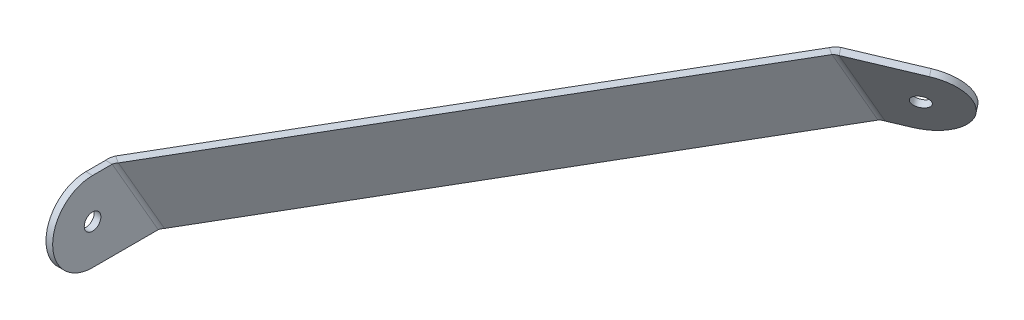
ISO-10303-21;
HEADER;
FILE_DESCRIPTION(('STEP AP214'),'2;1');
FILE_NAME('part.step','',(''),(''),'','','');
FILE_SCHEMA(('AUTOMOTIVE_DESIGN { 1 0 10303 214 1 1 1 1 }'));
ENDSEC;
DATA;
#1=APPLICATION_CONTEXT('core data for automotive mechanical design processes');
#2=APPLICATION_PROTOCOL_DEFINITION('international standard','automotive_design',2000,#1);
#3=PRODUCT_CONTEXT('',#1,'mechanical');
#4=PRODUCT('Part','Part','',(#3));
#5=PRODUCT_RELATED_PRODUCT_CATEGORY('part','',(#4));
#6=PRODUCT_DEFINITION_FORMATION('','',#4);
#7=PRODUCT_DEFINITION_CONTEXT('part definition',#1,'design');
#8=PRODUCT_DEFINITION('design','',#6,#7);
#9=PRODUCT_DEFINITION_SHAPE('','',#8);
#10=(LENGTH_UNIT() NAMED_UNIT(*) SI_UNIT(.MILLI.,.METRE.));
#11=(NAMED_UNIT(*) PLANE_ANGLE_UNIT() SI_UNIT($,.RADIAN.));
#12=(NAMED_UNIT(*) SI_UNIT($,.STERADIAN.) SOLID_ANGLE_UNIT());
#13=UNCERTAINTY_MEASURE_WITH_UNIT(LENGTH_MEASURE(1.E-05),#10,'distance_accuracy_value','');
#14=(GEOMETRIC_REPRESENTATION_CONTEXT(3) GLOBAL_UNCERTAINTY_ASSIGNED_CONTEXT((#13)) GLOBAL_UNIT_ASSIGNED_CONTEXT((#10,
#11,#12)) REPRESENTATION_CONTEXT('',''));
#15=CARTESIAN_POINT('',(0.,0.,0.));
#16=DIRECTION('',(0.,0.,1.));
#17=DIRECTION('',(1.,0.,0.));
#18=AXIS2_PLACEMENT_3D('',#15,#16,#17);
#19=CARTESIAN_POINT('',(-12.4707185432573,1.7039530518519,-2.95133325951953));
#20=DIRECTION('',(0.866025403784438,-0.250000000000003,0.433012701892219));
#21=DIRECTION('',(0.433012701892219,-0.0580127018922199,-0.899519052838329));
#22=AXIS2_PLACEMENT_3D('',#19,#20,#21);
#23=PLANE('',#22);
#24=DIRECTION('',(0.433012701892219,-0.0580127018922199,-0.899519052838329));
#25=VECTOR('',#24,1.);
#26=CARTESIAN_POINT('',(-7.70821854325723,20.1158990373753,-1.84619128847272));
#27=LINE('',#26,#25);
#28=CARTESIAN_POINT('',(-2.2391874454343,19.3831878043541,-13.2072845117416));
#29=VERTEX_POINT('',#28);
#30=CARTESIAN_POINT('',(108.455132698563,4.55296095970573,-243.158160260638));
#31=VERTEX_POINT('',#30);
#32=EDGE_CURVE('E525',#29,#31,#27,.T.);
#33=ORIENTED_EDGE('',*,*,#32,.T.);
#34=DIRECTION('',(0.,-0.866025403784437,-0.500000000000003));
#35=VECTOR('',#34,1.);
#36=CARTESIAN_POINT('',(108.455132698564,106.428812201527,-184.34011012225));
#37=LINE('',#36,#35);
#38=CARTESIAN_POINT('',(108.455132698563,-33.5470390402943,-265.155205516763));
#39=VERTEX_POINT('',#38);
#40=EDGE_CURVE('E548',#31,#39,#37,.T.);
#41=ORIENTED_EDGE('',*,*,#40,.T.);
#42=DIRECTION('',(0.433012701892219,-0.0580127018922199,-0.899519052838329));
#43=VECTOR('',#42,1.);
#44=CARTESIAN_POINT('',(-17.2332185432573,-16.7079929336715,-4.0564752305663));
#45=LINE('',#44,#43);
#46=CARTESIAN_POINT('',(-2.23918744543432,-18.7168121956459,-35.2043297678666));
#47=VERTEX_POINT('',#46);
#48=EDGE_CURVE('E521',#47,#39,#45,.T.);
#49=ORIENTED_EDGE('',*,*,#48,.F.);
#50=DIRECTION('',(0.,-0.866025403784436,-0.500000000000005));
#51=VECTOR('',#50,1.);
#52=CARTESIAN_POINT('',(-2.2391874454343,10.5647189021771,-18.2986299062539));
#53=LINE('',#52,#51);
#54=EDGE_CURVE('E524',#29,#47,#53,.T.);
#55=ORIENTED_EDGE('',*,*,#54,.F.);
#56=EDGE_LOOP('',(#33,#41,#49,#55));
#57=FACE_BOUND('',#56,.T.);
#58=ADVANCED_FACE('F70',(#57),#23,.F.);
#59=CARTESIAN_POINT('',(-17.2332185432573,-16.7079929336715,-4.0564752305663));
#60=DIRECTION('',(-0.250000000000003,-0.966506350946109,-0.0580127018922199));
#61=DIRECTION('',(0.433012701892219,-0.0580127018922199,-0.899519052838329));
#62=AXIS2_PLACEMENT_3D('',#59,#60,#61);
#63=PLANE('',#62);
#64=CARTESIAN_POINT('',(111.204763355579,-34.3407890402943,-263.780390188255));
#65=CARTESIAN_POINT('',(108.455132698563,-33.5470390402943,-265.155205516763));
#66=B_SPLINE_CURVE_WITH_KNOTS('',1,(#64,#65),.UNSPECIFIED.,.F.,.F.,(2,2),(0.,1.),.UNSPECIFIED.);
#67=CARTESIAN_POINT('',(111.204763355579,-34.3407890402943,-263.780390188255));
#68=VERTEX_POINT('',#67);
#69=EDGE_CURVE('E12',#68,#39,#66,.T.);
#70=ORIENTED_EDGE('',*,*,#69,.F.);
#71=DIRECTION('',(0.433012701892219,-0.0580127018922199,-0.899519052838329));
#72=VECTOR('',#71,1.);
#73=CARTESIAN_POINT('',(-14.4835878862417,-17.5017429336715,-2.68165990205852));
#74=LINE('',#73,#72);
#75=CARTESIAN_POINT('',(0.510443211581293,-19.5105621956459,-33.8295144393588));
#76=VERTEX_POINT('',#75);
#77=EDGE_CURVE('E89',#76,#68,#74,.T.);
#78=ORIENTED_EDGE('',*,*,#77,.F.);
#79=CARTESIAN_POINT('',(-2.23918744543431,-18.7168121956459,-35.2043297678666));
#80=CARTESIAN_POINT('',(0.510443211581283,-19.5105621956459,-33.8295144393589));
#81=B_SPLINE_CURVE_WITH_KNOTS('',1,(#79,#80),.UNSPECIFIED.,.F.,.F.,(2,2),(0.,1.),.UNSPECIFIED.);
#82=EDGE_CURVE('E542',#76,#47,#81,.F.);
#83=ORIENTED_EDGE('',*,*,#82,.T.);
#84=ORIENTED_EDGE('',*,*,#48,.T.);
#85=EDGE_LOOP('',(#70,#78,#83,#84));
#86=FACE_BOUND('',#85,.T.);
#87=ADVANCED_FACE('F72',(#86),#63,.T.);
#88=CARTESIAN_POINT('',(-7.70821854325723,20.1158990373753,-1.84619128847272));
#89=DIRECTION('',(-0.250000000000003,-0.966506350946109,-0.0580127018922199));
#90=DIRECTION('',(0.433012701892219,-0.0580127018922199,-0.899519052838329));
#91=AXIS2_PLACEMENT_3D('',#88,#89,#90);
#92=PLANE('',#91);
#93=CARTESIAN_POINT('',(108.455132698564,4.55296095970571,-243.158160260638));
#94=CARTESIAN_POINT('',(111.204763355579,3.7592109597057,-241.78334493213));
#95=B_SPLINE_CURVE_WITH_KNOTS('',1,(#93,#94),.UNSPECIFIED.,.F.,.F.,(2,2),(0.,1.),.UNSPECIFIED.);
#96=CARTESIAN_POINT('',(111.204763355579,3.75921095970574,-241.78334493213));
#97=VERTEX_POINT('',#96);
#98=EDGE_CURVE('E305',#31,#97,#95,.T.);
#99=ORIENTED_EDGE('',*,*,#98,.F.);
#100=ORIENTED_EDGE('',*,*,#32,.F.);
#101=CARTESIAN_POINT('',(0.510443211581287,18.5894378043541,-11.8324691832338));
#102=CARTESIAN_POINT('',(-2.23918744543431,19.3831878043541,-13.2072845117416));
#103=B_SPLINE_CURVE_WITH_KNOTS('',1,(#101,#102),.UNSPECIFIED.,.F.,.F.,(2,2),(0.,1.),.UNSPECIFIED.);
#104=CARTESIAN_POINT('',(0.510443211581295,18.5894378043541,-11.8324691832338));
#105=VERTEX_POINT('',#104);
#106=EDGE_CURVE('E669',#29,#105,#103,.F.);
#107=ORIENTED_EDGE('',*,*,#106,.T.);
#108=DIRECTION('',(0.433012701892219,-0.0580127018922199,-0.899519052838329));
#109=VECTOR('',#108,1.);
#110=CARTESIAN_POINT('',(-4.95858788624162,19.3221490373753,-0.471375959964944));
#111=LINE('',#110,#109);
#112=EDGE_CURVE('E97',#105,#97,#111,.T.);
#113=ORIENTED_EDGE('',*,*,#112,.T.);
#114=EDGE_LOOP('',(#99,#100,#107,#113));
#115=FACE_BOUND('',#114,.T.);
#116=ADVANCED_FACE('F607',(#115),#92,.F.);
#117=CARTESIAN_POINT('',(-9.72108788624168,0.910203051851891,-1.57651793101173));
#118=DIRECTION('',(0.866025403784438,-0.250000000000003,0.433012701892219));
#119=DIRECTION('',(0.433012701892219,-0.0580127018922199,-0.899519052838329));
#120=AXIS2_PLACEMENT_3D('',#117,#118,#119);
#121=PLANE('',#120);
#122=DIRECTION('',(0.,-0.866025403784437,-0.500000000000003));
#123=VECTOR('',#122,1.);
#124=CARTESIAN_POINT('',(111.204763355579,105.635062201527,-182.965294793742));
#125=LINE('',#124,#123);
#126=EDGE_CURVE('E82',#97,#68,#125,.T.);
#127=ORIENTED_EDGE('',*,*,#126,.F.);
#128=ORIENTED_EDGE('',*,*,#112,.F.);
#129=DIRECTION('',(0.,-0.866025403784436,-0.500000000000005));
#130=VECTOR('',#129,1.);
#131=CARTESIAN_POINT('',(0.510443211581293,9.77096890217713,-16.9238145777461));
#132=LINE('',#131,#130);
#133=EDGE_CURVE('E545',#105,#76,#132,.T.);
#134=ORIENTED_EDGE('',*,*,#133,.T.);
#135=ORIENTED_EDGE('',*,*,#77,.T.);
#136=EDGE_LOOP('',(#127,#128,#134,#135));
#137=FACE_BOUND('',#136,.T.);
#138=ADVANCED_FACE('F611',(#137),#121,.T.);
#139=CARTESIAN_POINT('',(-3.175,0.,0.));
#140=DIRECTION('',(1.,0.,0.));
#141=DIRECTION('',(0.,0.,-1.));
#142=AXIS2_PLACEMENT_3D('',#139,#140,#141);
#143=CYLINDRICAL_SURFACE('',#142,19.05);
#144=DIRECTION('',(-1.,0.,0.));
#145=VECTOR('',#144,1.);
#146=CARTESIAN_POINT('',(-3.175,-19.05,0.));
#147=LINE('',#146,#145);
#148=CARTESIAN_POINT('',(0.,-19.05,0.));
#149=VERTEX_POINT('',#148);
#150=CARTESIAN_POINT('',(-3.175,-19.05,0.));
#151=VERTEX_POINT('',#150);
#152=EDGE_CURVE('E459',#149,#151,#147,.T.);
#153=ORIENTED_EDGE('',*,*,#152,.F.);
#154=CARTESIAN_POINT('',(0.,0.,0.));
#155=DIRECTION('',(1.,0.,0.));
#156=DIRECTION('',(0.,0.,-1.));
#157=AXIS2_PLACEMENT_3D('',#154,#155,#156);
#158=CIRCLE('',#157,19.05);
#159=CARTESIAN_POINT('',(0.,19.05,0.));
#160=VERTEX_POINT('',#159);
#161=EDGE_CURVE('E455',#160,#149,#158,.T.);
#162=ORIENTED_EDGE('',*,*,#161,.F.);
#163=DIRECTION('',(-1.,0.,0.));
#164=VECTOR('',#163,1.);
#165=CARTESIAN_POINT('',(-3.175,19.05,0.));
#166=LINE('',#165,#164);
#167=CARTESIAN_POINT('',(-3.175,19.05,0.));
#168=VERTEX_POINT('',#167);
#169=EDGE_CURVE('E469',#160,#168,#166,.T.);
#170=ORIENTED_EDGE('',*,*,#169,.T.);
#171=CARTESIAN_POINT('',(-3.175,0.,0.));
#172=DIRECTION('',(1.,0.,0.));
#173=DIRECTION('',(0.,0.,-1.));
#174=AXIS2_PLACEMENT_3D('',#171,#172,#173);
#175=CIRCLE('',#174,19.05);
#176=EDGE_CURVE('E466',#168,#151,#175,.T.);
#177=ORIENTED_EDGE('',*,*,#176,.T.);
#178=EDGE_LOOP('',(#153,#162,#170,#177));
#179=FACE_BOUND('',#178,.T.);
#180=ADVANCED_FACE('F402',(#179),#143,.T.);
#181=CARTESIAN_POINT('',(-3.175,0.,0.));
#182=DIRECTION('',(1.,0.,0.));
#183=DIRECTION('',(0.,0.,-1.));
#184=AXIS2_PLACEMENT_3D('',#181,#182,#183);
#185=CYLINDRICAL_SURFACE('',#184,3.96874999999999);
#186=CARTESIAN_POINT('',(-3.175,0.,0.));
#187=DIRECTION('',(-1.,0.,0.));
#188=DIRECTION('',(0.,0.,1.));
#189=AXIS2_PLACEMENT_3D('',#186,#187,#188);
#190=CIRCLE('',#189,3.96874999999999);
#191=CARTESIAN_POINT('',(-3.175,0.,3.96874999999999));
#192=VERTEX_POINT('',#191);
#193=EDGE_CURVE('E462',#192,#192,#190,.T.);
#194=ORIENTED_EDGE('',*,*,#193,.T.);
#195=EDGE_LOOP('',(#194));
#196=FACE_BOUND('',#195,.T.);
#197=CARTESIAN_POINT('',(0.,0.,0.));
#198=DIRECTION('',(-1.,0.,0.));
#199=DIRECTION('',(0.,0.,1.));
#200=AXIS2_PLACEMENT_3D('',#197,#198,#199);
#201=CIRCLE('',#200,3.96874999999999);
#202=CARTESIAN_POINT('',(0.,0.,3.96874999999999));
#203=VERTEX_POINT('',#202);
#204=EDGE_CURVE('E445',#203,#203,#201,.T.);
#205=ORIENTED_EDGE('',*,*,#204,.F.);
#206=EDGE_LOOP('',(#205));
#207=FACE_BOUND('',#206,.T.);
#208=ADVANCED_FACE('F690',(#196,#207),#185,.F.);
#209=CARTESIAN_POINT('',(-3.175,0.,0.));
#210=DIRECTION('',(1.,0.,0.));
#211=DIRECTION('',(0.,0.,-1.));
#212=AXIS2_PLACEMENT_3D('',#209,#210,#211);
#213=PLANE('',#212);
#214=ORIENTED_EDGE('',*,*,#193,.F.);
#215=EDGE_LOOP('',(#214));
#216=FACE_BOUND('',#215,.T.);
#217=DIRECTION('',(0.,0.,-1.));
#218=VECTOR('',#217,1.);
#219=CARTESIAN_POINT('',(-3.175,19.05,0.));
#220=LINE('',#219,#218);
#221=CARTESIAN_POINT('',(-3.175,19.05,-9.36685894998663));
#222=VERTEX_POINT('',#221);
#223=EDGE_CURVE('E465',#168,#222,#220,.T.);
#224=ORIENTED_EDGE('',*,*,#223,.T.);
#225=DIRECTION('',(0.,-0.866025403784436,-0.500000000000005));
#226=VECTOR('',#225,1.);
#227=CARTESIAN_POINT('',(-3.175,8.81846890217713,-15.2740361835368));
#228=LINE('',#227,#226);
#229=CARTESIAN_POINT('',(-3.175,-19.05,-31.3639042061116));
#230=VERTEX_POINT('',#229);
#231=EDGE_CURVE('E461',#222,#230,#228,.T.);
#232=ORIENTED_EDGE('',*,*,#231,.T.);
#233=DIRECTION('',(0.,0.,-1.));
#234=VECTOR('',#233,1.);
#235=CARTESIAN_POINT('',(-3.175,-19.05,0.));
#236=LINE('',#235,#234);
#237=EDGE_CURVE('E458',#151,#230,#236,.T.);
#238=ORIENTED_EDGE('',*,*,#237,.F.);
#239=ORIENTED_EDGE('',*,*,#176,.F.);
#240=EDGE_LOOP('',(#224,#232,#238,#239));
#241=FACE_BOUND('',#240,.T.);
#242=ADVANCED_FACE('F498',(#216,#241),#213,.F.);
#243=CARTESIAN_POINT('',(-3.175,-19.05,0.));
#244=DIRECTION('',(0.,-1.,0.));
#245=DIRECTION('',(0.,0.,-1.));
#246=AXIS2_PLACEMENT_3D('',#243,#244,#245);
#247=PLANE('',#246);
#248=CARTESIAN_POINT('',(0.,-19.05,-31.3639042061116));
#249=CARTESIAN_POINT('',(-3.175,-19.05,-31.3639042061116));
#250=B_SPLINE_CURVE_WITH_KNOTS('',1,(#248,#249),.UNSPECIFIED.,.F.,.F.,(2,2),(0.,1.),.UNSPECIFIED.);
#251=CARTESIAN_POINT('',(0.,-19.05,-31.3639042061116));
#252=VERTEX_POINT('',#251);
#253=EDGE_CURVE('E441',#252,#230,#250,.T.);
#254=ORIENTED_EDGE('',*,*,#253,.F.);
#255=DIRECTION('',(0.,0.,-1.));
#256=VECTOR('',#255,1.);
#257=CARTESIAN_POINT('',(0.,-19.05,0.));
#258=LINE('',#257,#256);
#259=EDGE_CURVE('E454',#149,#252,#258,.T.);
#260=ORIENTED_EDGE('',*,*,#259,.F.);
#261=ORIENTED_EDGE('',*,*,#152,.T.);
#262=ORIENTED_EDGE('',*,*,#237,.T.);
#263=EDGE_LOOP('',(#254,#260,#261,#262));
#264=FACE_BOUND('',#263,.T.);
#265=ADVANCED_FACE('F487',(#264),#247,.T.);
#266=CARTESIAN_POINT('',(0.,0.,0.));
#267=DIRECTION('',(1.,0.,0.));
#268=DIRECTION('',(0.,0.,-1.));
#269=AXIS2_PLACEMENT_3D('',#266,#267,#268);
#270=PLANE('',#269);
#271=DIRECTION('',(0.,-0.866025403784436,-0.500000000000005));
#272=VECTOR('',#271,1.);
#273=CARTESIAN_POINT('',(0.,8.81846890217713,-15.2740361835368));
#274=LINE('',#273,#272);
#275=CARTESIAN_POINT('',(0.,19.05,-9.36685894998663));
#276=VERTEX_POINT('',#275);
#277=EDGE_CURVE('E485',#276,#252,#274,.T.);
#278=ORIENTED_EDGE('',*,*,#277,.F.);
#279=DIRECTION('',(0.,0.,-1.));
#280=VECTOR('',#279,1.);
#281=CARTESIAN_POINT('',(0.,19.05,0.));
#282=LINE('',#281,#280);
#283=EDGE_CURVE('E453',#160,#276,#282,.T.);
#284=ORIENTED_EDGE('',*,*,#283,.F.);
#285=ORIENTED_EDGE('',*,*,#161,.T.);
#286=ORIENTED_EDGE('',*,*,#259,.T.);
#287=EDGE_LOOP('',(#278,#284,#285,#286));
#288=FACE_BOUND('',#287,.T.);
#289=ORIENTED_EDGE('',*,*,#204,.T.);
#290=EDGE_LOOP('',(#289));
#291=FACE_BOUND('',#290,.T.);
#292=ADVANCED_FACE('F497',(#288,#291),#270,.T.);
#293=CARTESIAN_POINT('',(-3.175,19.05,0.));
#294=DIRECTION('',(0.,-1.,0.));
#295=DIRECTION('',(0.,0.,-1.));
#296=AXIS2_PLACEMENT_3D('',#293,#294,#295);
#297=PLANE('',#296);
#298=CARTESIAN_POINT('',(-3.175,19.05,-9.36685894998662));
#299=CARTESIAN_POINT('',(0.,19.05,-9.36685894998662));
#300=B_SPLINE_CURVE_WITH_KNOTS('',1,(#298,#299),.UNSPECIFIED.,.F.,.F.,(2,2),(0.,1.),.UNSPECIFIED.);
#301=EDGE_CURVE('E428',#222,#276,#300,.T.);
#302=ORIENTED_EDGE('',*,*,#301,.F.);
#303=ORIENTED_EDGE('',*,*,#223,.F.);
#304=ORIENTED_EDGE('',*,*,#169,.F.);
#305=ORIENTED_EDGE('',*,*,#283,.T.);
#306=EDGE_LOOP('',(#302,#303,#304,#305));
#307=FACE_BOUND('',#306,.T.);
#308=ADVANCED_FACE('F401',(#307),#297,.F.);
#309=CARTESIAN_POINT('',(-3.175,19.05,-9.36685894998662));
#310=CARTESIAN_POINT('',(-3.175,19.1887319368214,-10.6964678397321));
#311=CARTESIAN_POINT('',(-2.84960796744824,19.3262367104913,-12.0193241970861));
#312=CARTESIAN_POINT('',(-2.23918744543431,19.3831878043541,-13.2072845117416));
#313=CARTESIAN_POINT('',(0.,19.05,-9.36685894998662));
#314=CARTESIAN_POINT('',(0.,18.9113125892921,-10.2156138173841));
#315=CARTESIAN_POINT('',(0.177593425882297,18.7727186307015,-11.0609523774069));
#316=CARTESIAN_POINT('',(0.510443211581287,18.5894378043541,-11.8324691832338));
#317=B_SPLINE_SURFACE_WITH_KNOTS('',1,3,((#309,#310,#311,#312),(#313,#314,#315,#316)),
.UNSPECIFIED.,.F.,.F.,.F.,(2,2),(4,4),(0.,1.),(0.,1.),.UNSPECIFIED.);
#318=CARTESIAN_POINT('',(0.,19.05,-9.36685894998662));
#319=CARTESIAN_POINT('',(0.,18.9113125892921,-10.2156138173841));
#320=CARTESIAN_POINT('',(0.177593425882297,18.7727186307015,-11.0609523774069));
#321=CARTESIAN_POINT('',(0.510443211581287,18.5894378043541,-11.8324691832338));
#322=B_SPLINE_CURVE_WITH_KNOTS('',3,(#318,#319,#320,#321),.UNSPECIFIED.,.F.,.F.,(4,4),(0.,1.),.UNSPECIFIED.);
#323=EDGE_CURVE('E554',#276,#105,#322,.T.);
#324=CARTESIAN_POINT('',(-2.23918744543431,19.3831878043541,-13.2072845117416));
#325=CARTESIAN_POINT('',(-2.84960796744824,19.3262367104913,-12.0193241970861));
#326=CARTESIAN_POINT('',(-3.175,19.1887319368214,-10.6964678397321));
#327=CARTESIAN_POINT('',(-3.175,19.05,-9.36685894998662));
#328=B_SPLINE_CURVE_WITH_KNOTS('',3,(#324,#325,#326,#327),.UNSPECIFIED.,.F.,.F.,(4,4),(0.,1.),.UNSPECIFIED.);
#329=EDGE_CURVE('E384',#222,#29,#328,.F.);
#330=ORIENTED_EDGE('',*,*,#301,.T.);
#331=ORIENTED_EDGE('',*,*,#323,.T.);
#332=ORIENTED_EDGE('',*,*,#106,.F.);
#333=ORIENTED_EDGE('',*,*,#329,.F.);
#334=EDGE_LOOP('',(#330,#331,#332,#333));
#335=FACE_BOUND('',#334,.T.);
#336=ADVANCED_FACE('F390',(#335),#317,.T.);
#337=CARTESIAN_POINT('',(-2.23918744543431,-18.7168121956459,-35.2043297678666));
#338=CARTESIAN_POINT('',(-2.84960796744824,-18.7737632895088,-34.0163694532111));
#339=CARTESIAN_POINT('',(-3.175,-18.9112680631787,-32.6935130958571));
#340=CARTESIAN_POINT('',(-3.175,-19.05,-31.3639042061116));
#341=CARTESIAN_POINT('',(0.510443211581283,-19.5105621956459,-33.8295144393589));
#342=CARTESIAN_POINT('',(0.1775934258823,-19.3272813692986,-33.0579976335319));
#343=CARTESIAN_POINT('',(0.,-19.1886874107079,-32.2126590735092));
#344=CARTESIAN_POINT('',(0.,-19.05,-31.3639042061116));
#345=B_SPLINE_SURFACE_WITH_KNOTS('',1,3,((#337,#338,#339,#340),(#341,#342,#343,#344)),
.UNSPECIFIED.,.F.,.F.,.F.,(2,2),(4,4),(0.,1.),(0.,1.),.UNSPECIFIED.);
#346=CARTESIAN_POINT('',(0.510443211581283,-19.5105621956459,-33.8295144393589));
#347=CARTESIAN_POINT('',(0.1775934258823,-19.3272813692986,-33.0579976335319));
#348=CARTESIAN_POINT('',(0.,-19.1886874107079,-32.2126590735092));
#349=CARTESIAN_POINT('',(0.,-19.05,-31.3639042061116));
#350=B_SPLINE_CURVE_WITH_KNOTS('',3,(#346,#347,#348,#349),.UNSPECIFIED.,.F.,.F.,(4,4),(0.,1.),.UNSPECIFIED.);
#351=EDGE_CURVE('E347',#76,#252,#350,.T.);
#352=CARTESIAN_POINT('',(-3.175,-19.05,-31.3639042061116));
#353=CARTESIAN_POINT('',(-3.175,-18.9112680631787,-32.6935130958571));
#354=CARTESIAN_POINT('',(-2.84960796744824,-18.7737632895088,-34.0163694532111));
#355=CARTESIAN_POINT('',(-2.23918744543431,-18.7168121956459,-35.2043297678666));
#356=B_SPLINE_CURVE_WITH_KNOTS('',3,(#352,#353,#354,#355),.UNSPECIFIED.,.F.,.F.,(4,4),(0.,1.),.UNSPECIFIED.);
#357=EDGE_CURVE('E340',#47,#230,#356,.F.);
#358=ORIENTED_EDGE('',*,*,#82,.F.);
#359=ORIENTED_EDGE('',*,*,#351,.T.);
#360=ORIENTED_EDGE('',*,*,#253,.T.);
#361=ORIENTED_EDGE('',*,*,#357,.F.);
#362=EDGE_LOOP('',(#358,#359,#360,#361));
#363=FACE_BOUND('',#362,.T.);
#364=ADVANCED_FACE('F360',(#363),#345,.T.);
#365=CARTESIAN_POINT('',(3.81,39.6841629259491,2.54628056981283));
#366=DIRECTION('',(0.,-0.866025403784436,-0.500000000000005));
#367=DIRECTION('',(0.,0.500000000000005,-0.866025403784436));
#368=AXIS2_PLACEMENT_3D('',#365,#366,#367);
#369=CYLINDRICAL_SURFACE('',#368,6.985);
#370=ORIENTED_EDGE('',*,*,#357,.T.);
#371=ORIENTED_EDGE('',*,*,#231,.F.);
#372=ORIENTED_EDGE('',*,*,#329,.T.);
#373=ORIENTED_EDGE('',*,*,#54,.T.);
#374=EDGE_LOOP('',(#370,#371,#372,#373));
#375=FACE_BOUND('',#374,.T.);
#376=ADVANCED_FACE('F279',(#375),#369,.T.);
#377=CARTESIAN_POINT('',(3.81,39.6841629259491,2.54628056981283));
#378=DIRECTION('',(0.,-0.866025403784436,-0.500000000000005));
#379=DIRECTION('',(0.,0.500000000000005,-0.866025403784436));
#380=AXIS2_PLACEMENT_3D('',#377,#378,#379);
#381=CYLINDRICAL_SURFACE('',#380,3.81);
#382=ORIENTED_EDGE('',*,*,#351,.F.);
#383=ORIENTED_EDGE('',*,*,#133,.F.);
#384=ORIENTED_EDGE('',*,*,#323,.F.);
#385=ORIENTED_EDGE('',*,*,#277,.T.);
#386=EDGE_LOOP('',(#382,#383,#384,#385));
#387=FACE_BOUND('',#386,.T.);
#388=ADVANCED_FACE('F275',(#387),#381,.F.);
#389=CARTESIAN_POINT('',(108.455132698564,4.55296095970571,-243.158160260638));
#390=CARTESIAN_POINT('',(109.065553220577,4.60991205356854,-244.346120575294));
#391=CARTESIAN_POINT('',(109.954540785887,4.58472081096256,-245.387179166269));
#392=CARTESIAN_POINT('',(111.011820143998,4.41824248677693,-246.188148376959));
#393=CARTESIAN_POINT('',(111.204763355579,3.7592109597057,-241.78334493213));
#394=CARTESIAN_POINT('',(111.537613141278,3.57593013335837,-242.554861737957));
#395=CARTESIAN_POINT('',(112.022807403879,3.34853946182649,-243.246399879621));
#396=CARTESIAN_POINT('',(112.599320143998,3.04342715826912,-243.806898376959));
#397=B_SPLINE_SURFACE_WITH_KNOTS('',1,3,((#389,#390,#391,#392),(#393,#394,#395,#396)),
.UNSPECIFIED.,.F.,.F.,.F.,(2,2),(4,4),(0.,1.),(0.,1.),.UNSPECIFIED.);
#398=CARTESIAN_POINT('',(111.204763355579,3.7592109597057,-241.78334493213));
#399=CARTESIAN_POINT('',(111.537613141278,3.57593013335837,-242.554861737957));
#400=CARTESIAN_POINT('',(112.022807403879,3.34853946182649,-243.246399879621));
#401=CARTESIAN_POINT('',(112.599320143998,3.04342715826912,-243.806898376959));
#402=B_SPLINE_CURVE_WITH_KNOTS('',3,(#398,#399,#400,#401),.UNSPECIFIED.,.F.,.F.,(4,4),(0.,1.),.UNSPECIFIED.);
#403=CARTESIAN_POINT('',(112.599320143998,3.04342715826918,-243.806898376959));
#404=VERTEX_POINT('',#403);
#405=EDGE_CURVE('E174',#97,#404,#402,.T.);
#406=CARTESIAN_POINT('',(112.599320143998,3.04342715826912,-243.806898376959));
#407=CARTESIAN_POINT('',(111.011820143998,4.41824248677693,-246.188148376959));
#408=B_SPLINE_CURVE_WITH_KNOTS('',1,(#406,#407),.UNSPECIFIED.,.F.,.F.,(2,2),(0.,1.),.UNSPECIFIED.);
#409=CARTESIAN_POINT('',(111.011820143998,4.41824248677696,-246.188148376959));
#410=VERTEX_POINT('',#409);
#411=EDGE_CURVE('E191',#410,#404,#408,.F.);
#412=CARTESIAN_POINT('',(111.011820143998,4.41824248677693,-246.188148376959));
#413=CARTESIAN_POINT('',(109.954540785887,4.58472081096256,-245.387179166269));
#414=CARTESIAN_POINT('',(109.065553220577,4.60991205356854,-244.346120575294));
#415=CARTESIAN_POINT('',(108.455132698564,4.55296095970571,-243.158160260638));
#416=B_SPLINE_CURVE_WITH_KNOTS('',3,(#412,#413,#414,#415),.UNSPECIFIED.,.F.,.F.,(4,4),(0.,1.),.UNSPECIFIED.);
#417=EDGE_CURVE('E240',#31,#410,#416,.F.);
#418=ORIENTED_EDGE('',*,*,#98,.T.);
#419=ORIENTED_EDGE('',*,*,#405,.T.);
#420=ORIENTED_EDGE('',*,*,#411,.F.);
#421=ORIENTED_EDGE('',*,*,#417,.F.);
#422=EDGE_LOOP('',(#418,#419,#420,#421));
#423=FACE_BOUND('',#422,.T.);
#424=ADVANCED_FACE('F264',(#423),#397,.T.);
#425=CARTESIAN_POINT('',(111.011820143998,-33.6817575132231,-268.185193633084));
#426=CARTESIAN_POINT('',(109.954540785887,-33.5152791890374,-267.384224422394));
#427=CARTESIAN_POINT('',(109.065553220577,-33.4900879464315,-266.343165831419));
#428=CARTESIAN_POINT('',(108.455132698563,-33.5470390402943,-265.155205516763));
#429=CARTESIAN_POINT('',(112.599320143998,-35.0565728417309,-265.803943633084));
#430=CARTESIAN_POINT('',(112.022807403879,-34.7514605381735,-265.243445135746));
#431=CARTESIAN_POINT('',(111.537613141278,-34.5240698666417,-264.551906994082));
#432=CARTESIAN_POINT('',(111.204763355579,-34.3407890402943,-263.780390188255));
#433=B_SPLINE_SURFACE_WITH_KNOTS('',1,3,((#425,#426,#427,#428),(#429,#430,#431,#432)),
.UNSPECIFIED.,.F.,.F.,.F.,(2,2),(4,4),(0.,1.),(0.,1.),.UNSPECIFIED.);
#434=CARTESIAN_POINT('',(111.011820143998,-33.6817575132231,-268.185193633084));
#435=CARTESIAN_POINT('',(112.599320143998,-35.0565728417309,-265.803943633084));
#436=B_SPLINE_CURVE_WITH_KNOTS('',1,(#434,#435),.UNSPECIFIED.,.F.,.F.,(2,2),(0.,1.),.UNSPECIFIED.);
#437=CARTESIAN_POINT('',(112.599320143998,-35.0565728417308,-265.803943633084));
#438=VERTEX_POINT('',#437);
#439=CARTESIAN_POINT('',(111.011820143998,-33.6817575132231,-268.185193633084));
#440=VERTEX_POINT('',#439);
#441=EDGE_CURVE('E170',#438,#440,#436,.F.);
#442=CARTESIAN_POINT('',(112.599320143998,-35.0565728417309,-265.803943633084));
#443=CARTESIAN_POINT('',(112.022807403879,-34.7514605381735,-265.243445135746));
#444=CARTESIAN_POINT('',(111.537613141278,-34.5240698666417,-264.551906994082));
#445=CARTESIAN_POINT('',(111.204763355579,-34.3407890402943,-263.780390188255));
#446=B_SPLINE_CURVE_WITH_KNOTS('',3,(#442,#443,#444,#445),.UNSPECIFIED.,.F.,.F.,(4,4),(0.,1.),.UNSPECIFIED.);
#447=EDGE_CURVE('E559',#438,#68,#446,.T.);
#448=CARTESIAN_POINT('',(108.455132698563,-33.5470390402943,-265.155205516763));
#449=CARTESIAN_POINT('',(109.065553220577,-33.4900879464315,-266.343165831419));
#450=CARTESIAN_POINT('',(109.954540785887,-33.5152791890374,-267.384224422394));
#451=CARTESIAN_POINT('',(111.011820143998,-33.6817575132231,-268.185193633084));
#452=B_SPLINE_CURVE_WITH_KNOTS('',3,(#448,#449,#450,#451),.UNSPECIFIED.,.F.,.F.,(4,4),(0.,1.),.UNSPECIFIED.);
#453=EDGE_CURVE('E556',#440,#39,#452,.F.);
#454=ORIENTED_EDGE('',*,*,#441,.F.);
#455=ORIENTED_EDGE('',*,*,#447,.T.);
#456=ORIENTED_EDGE('',*,*,#69,.T.);
#457=ORIENTED_EDGE('',*,*,#453,.F.);
#458=EDGE_LOOP('',(#454,#455,#456,#457));
#459=FACE_BOUND('',#458,.T.);
#460=ADVANCED_FACE('F216',(#459),#433,.T.);
#461=CARTESIAN_POINT('',(114.504320143998,24.7160250962589,-227.484218123422));
#462=DIRECTION('',(0.,-0.866025403784437,-0.500000000000003));
#463=DIRECTION('',(0.,0.500000000000003,-0.866025403784437));
#464=AXIS2_PLACEMENT_3D('',#461,#462,#463);
#465=CYLINDRICAL_SURFACE('',#464,6.985);
#466=ORIENTED_EDGE('',*,*,#453,.T.);
#467=ORIENTED_EDGE('',*,*,#40,.F.);
#468=ORIENTED_EDGE('',*,*,#417,.T.);
#469=DIRECTION('',(0.,-0.866025403784437,-0.500000000000003));
#470=VECTOR('',#469,1.);
#471=CARTESIAN_POINT('',(111.011820143998,107.707155924244,-186.554266399533));
#472=LINE('',#471,#470);
#473=EDGE_CURVE('E199',#410,#440,#472,.T.);
#474=ORIENTED_EDGE('',*,*,#473,.T.);
#475=EDGE_LOOP('',(#466,#467,#468,#474));
#476=FACE_BOUND('',#475,.T.);
#477=ADVANCED_FACE('F206',(#476),#465,.T.);
#478=CARTESIAN_POINT('',(114.504320143998,24.7160250962589,-227.484218123422));
#479=DIRECTION('',(0.,-0.866025403784437,-0.500000000000003));
#480=DIRECTION('',(0.,0.500000000000003,-0.866025403784437));
#481=AXIS2_PLACEMENT_3D('',#478,#479,#480);
#482=CYLINDRICAL_SURFACE('',#481,3.81);
#483=ORIENTED_EDGE('',*,*,#447,.F.);
#484=DIRECTION('',(0.,-0.866025403784437,-0.500000000000003));
#485=VECTOR('',#484,1.);
#486=CARTESIAN_POINT('',(112.599320143998,106.332340595736,-184.173016399533));
#487=LINE('',#486,#485);
#488=EDGE_CURVE('E576',#404,#438,#487,.T.);
#489=ORIENTED_EDGE('',*,*,#488,.F.);
#490=ORIENTED_EDGE('',*,*,#405,.F.);
#491=ORIENTED_EDGE('',*,*,#126,.T.);
#492=EDGE_LOOP('',(#483,#489,#490,#491));
#493=FACE_BOUND('',#492,.T.);
#494=ADVANCED_FACE('F215',(#493),#482,.F.);
#495=CARTESIAN_POINT('',(126.285856327535,-19.0409919643116,-269.915034491302));
#496=DIRECTION('',(0.499999999999998,-0.433012701892223,0.749999999999999));
#497=DIRECTION('',(0.749999999999999,-0.216506350946112,-0.625));
#498=AXIS2_PLACEMENT_3D('',#495,#496,#497);
#499=CYLINDRICAL_SURFACE('',#498,3.96874999999999);
#500=CARTESIAN_POINT('',(126.285856327535,-19.0409919643116,-269.915034491302));
#501=DIRECTION('',(-0.499999999999998,0.433012701892223,-0.749999999999999));
#502=DIRECTION('',(-0.749999999999999,0.216506350946112,0.625));
#503=AXIS2_PLACEMENT_3D('',#500,#501,#502);
#504=CIRCLE('',#503,3.96874999999999);
#505=CARTESIAN_POINT('',(129.262418827535,-19.900251544629,-272.395503241302));
#506=VERTEX_POINT('',#505);
#507=EDGE_CURVE('E183',#506,#506,#504,.T.);
#508=CARTESIAN_POINT('',(127.873356327534,-20.4158072928194,-267.533784491302));
#509=DIRECTION('',(-0.499999999999998,0.433012701892223,-0.749999999999999));
#510=DIRECTION('',(-0.749999999999999,0.216506350946112,0.625));
#511=AXIS2_PLACEMENT_3D('',#508,#509,#510);
#512=CIRCLE('',#511,3.96874999999999);
#513=CARTESIAN_POINT('',(130.849918827535,-21.2750668731368,-270.014253241302));
#514=VERTEX_POINT('',#513);
#515=EDGE_CURVE('E567',#514,#514,#512,.T.);
#516=CARTESIAN_POINT('',(129.262418827535,-19.900251544629,-272.395503241302));
#517=CARTESIAN_POINT('',(129.278955285868,-19.9145725376342,-272.370698553802));
#518=CARTESIAN_POINT('',(129.295491744201,-19.9288935306395,-272.345893866302));
#519=CARTESIAN_POINT('',(129.328564660868,-19.9575355166501,-272.296284491302));
#520=CARTESIAN_POINT('',(129.345101119201,-19.9718565096554,-272.271479803802));
#521=CARTESIAN_POINT('',(129.378174035868,-20.000498495666,-272.221870428802));
#522=CARTESIAN_POINT('',(129.394710494201,-20.0148194886713,-272.197065741302));
#523=CARTESIAN_POINT('',(129.427783410868,-20.0434614746819,-272.147456366302));
#524=CARTESIAN_POINT('',(129.444319869201,-20.0577824676872,-272.122651678802));
#525=CARTESIAN_POINT('',(129.477392785868,-20.0864244536977,-272.073042303802));
#526=CARTESIAN_POINT('',(129.493929244201,-20.100745446703,-272.048237616302));
#527=CARTESIAN_POINT('',(129.527002160868,-20.1293874327136,-271.998628241302));
#528=CARTESIAN_POINT('',(129.543538619201,-20.1437084257189,-271.973823553802));
#529=CARTESIAN_POINT('',(129.576611535868,-20.1723504117295,-271.924214178802));
#530=CARTESIAN_POINT('',(129.593147994201,-20.1866714047348,-271.899409491302));
#531=CARTESIAN_POINT('',(129.626220910868,-20.2153133907453,-271.849800116302));
#532=CARTESIAN_POINT('',(129.642757369201,-20.2296343837506,-271.824995428802));
#533=CARTESIAN_POINT('',(129.675830285868,-20.2582763697612,-271.775386053802));
#534=CARTESIAN_POINT('',(129.692366744201,-20.2725973627665,-271.750581366302));
#535=CARTESIAN_POINT('',(129.725439660868,-20.3012393487771,-271.700971991302));
#536=CARTESIAN_POINT('',(129.741976119201,-20.3155603417824,-271.676167303802));
#537=CARTESIAN_POINT('',(129.775049035868,-20.3442023277929,-271.626557928802));
#538=CARTESIAN_POINT('',(129.791585494201,-20.3585233207982,-271.601753241302));
#539=CARTESIAN_POINT('',(129.824658410868,-20.3871653068088,-271.552143866302));
#540=CARTESIAN_POINT('',(129.841194869201,-20.4014862998141,-271.527339178802));
#541=CARTESIAN_POINT('',(129.874267785868,-20.4301282858247,-271.477729803802));
#542=CARTESIAN_POINT('',(129.890804244201,-20.44444927883,-271.452925116302));
#543=CARTESIAN_POINT('',(129.923877160868,-20.4730912648405,-271.403315741302));
#544=CARTESIAN_POINT('',(129.940413619201,-20.4874122578458,-271.378511053802));
#545=CARTESIAN_POINT('',(129.973486535868,-20.5160542438564,-271.328901678802));
#546=CARTESIAN_POINT('',(129.990022994201,-20.5303752368617,-271.304096991302));
#547=CARTESIAN_POINT('',(130.023095910868,-20.5590172228723,-271.254487616302));
#548=CARTESIAN_POINT('',(130.039632369201,-20.5733382158776,-271.229682928802));
#549=CARTESIAN_POINT('',(130.072705285868,-20.6019802018881,-271.180073553802));
#550=CARTESIAN_POINT('',(130.089241744201,-20.6163011948934,-271.155268866302));
#551=CARTESIAN_POINT('',(130.122314660868,-20.644943180904,-271.105659491302));
#552=CARTESIAN_POINT('',(130.138851119201,-20.6592641739093,-271.080854803802));
#553=CARTESIAN_POINT('',(130.171924035868,-20.6879061599199,-271.031245428802));
#554=CARTESIAN_POINT('',(130.188460494201,-20.7022271529252,-271.006440741302));
#555=CARTESIAN_POINT('',(130.221533410868,-20.7308691389358,-270.956831366302));
#556=CARTESIAN_POINT('',(130.238069869201,-20.745190131941,-270.932026678802));
#557=CARTESIAN_POINT('',(130.271142785868,-20.7738321179516,-270.882417303802));
#558=CARTESIAN_POINT('',(130.287679244201,-20.7881531109569,-270.857612616302));
#559=CARTESIAN_POINT('',(130.320752160868,-20.8167950969675,-270.808003241302));
#560=CARTESIAN_POINT('',(130.337288619201,-20.8311160899728,-270.783198553802));
#561=CARTESIAN_POINT('',(130.370361535868,-20.8597580759834,-270.733589178802));
#562=CARTESIAN_POINT('',(130.386897994201,-20.8740790689886,-270.708784491302));
#563=CARTESIAN_POINT('',(130.419970910868,-20.9027210549992,-270.659175116302));
#564=CARTESIAN_POINT('',(130.436507369201,-20.9170420480045,-270.634370428802));
#565=CARTESIAN_POINT('',(130.469580285868,-20.9456840340151,-270.584761053802));
#566=CARTESIAN_POINT('',(130.486116744201,-20.9600050270204,-270.559956366302));
#567=CARTESIAN_POINT('',(130.519189660868,-20.988647013031,-270.510346991302));
#568=CARTESIAN_POINT('',(130.535726119201,-21.0029680060362,-270.485542303802));
#569=CARTESIAN_POINT('',(130.568799035868,-21.0316099920468,-270.435932928802));
#570=CARTESIAN_POINT('',(130.585335494201,-21.0459309850521,-270.411128241302));
#571=CARTESIAN_POINT('',(130.618408410868,-21.0745729710627,-270.361518866302));
#572=CARTESIAN_POINT('',(130.634944869201,-21.088893964068,-270.336714178802));
#573=CARTESIAN_POINT('',(130.668017785868,-21.1175359500786,-270.287104803802));
#574=CARTESIAN_POINT('',(130.684554244201,-21.1318569430839,-270.262300116302));
#575=CARTESIAN_POINT('',(130.717627160868,-21.1604989290944,-270.212690741302));
#576=CARTESIAN_POINT('',(130.734163619201,-21.1748199220997,-270.187886053802));
#577=CARTESIAN_POINT('',(130.767236535868,-21.2034619081103,-270.138276678802));
#578=CARTESIAN_POINT('',(130.783772994201,-21.2177829011156,-270.113471991302));
#579=CARTESIAN_POINT('',(130.816845910868,-21.2464248871262,-270.063862616302));
#580=CARTESIAN_POINT('',(130.833382369201,-21.2607458801315,-270.039057928802));
#581=CARTESIAN_POINT('',(130.849918827535,-21.2750668731368,-270.014253241302));
#582=B_SPLINE_CURVE_WITH_KNOTS('',3,(#516,#517,#518,#519,#520,#521,#522,#523,#524,#525,#526,
#527,#528,#529,#530,#531,#532,#533,#534,#535,#536,#537,#538,#539,#540,#541,#542,#543,#544,#545,
#546,#547,#548,#549,#550,#551,#552,#553,#554,#555,#556,#557,#558,#559,#560,#561,#562,#563,#564,
#565,#566,#567,#568,#569,#570,#571,#572,#573,#574,#575,#576,#577,#578,#579,#580,#581),
.UNSPECIFIED.,.F.,.F.,(4,2,2,2,2,2,2,2,2,2,2,2,2,2,2,2,2,2,2,2,2,2,2,2,2,2,2,2,2,2,2,2,4),(0.,
0.0992187500000256,0.19843750000001,0.297656250000021,0.396875000000005,0.496093750000031,
0.595312499999999,0.694531250000025,0.793750000000009,0.892968750000021,0.992187500000005,
1.09140625000002,1.190625,1.28984375000002,1.38906249999999,1.48828125000002,1.5875,
1.68671874999997,1.7859375,1.88515624999997,1.98437499999999,2.08359374999998,2.18281249999999,
2.28203124999997,2.38125,2.48046874999997,2.57968749999999,2.67890624999996,2.77812499999999,
2.87734374999997,2.97656249999998,3.07578124999997,3.17499999999999),.UNSPECIFIED.);
#583=EDGE_CURVE('BSEAM820',#506,#514,#582,.T.);
#584=ORIENTED_EDGE('',*,*,#507,.T.);
#585=ORIENTED_EDGE('',*,*,#515,.F.);
#586=ORIENTED_EDGE('',*,*,#583,.T.);
#587=ORIENTED_EDGE('',*,*,#583,.F.);
#588=EDGE_LOOP('',(#584,#586,#585,#587));
#589=FACE_BOUND('',#588,.T.);
#590=ADVANCED_FACE('F820',(#589),#499,.F.);
#591=CARTESIAN_POINT('',(126.285856327535,-19.0409919643116,-269.915034491302));
#592=DIRECTION('',(0.499999999999998,-0.433012701892223,0.749999999999999));
#593=DIRECTION('',(0.749999999999999,-0.216506350946112,-0.625));
#594=AXIS2_PLACEMENT_3D('',#591,#592,#593);
#595=CYLINDRICAL_SURFACE('',#594,19.05);
#596=DIRECTION('',(-0.499999999999998,0.433012701892223,-0.749999999999999));
#597=VECTOR('',#596,1.);
#598=CARTESIAN_POINT('',(134.534748298581,-2.37224196431161,-265.790588505779));
#599=LINE('',#598,#597);
#600=CARTESIAN_POINT('',(136.122248298581,-3.74705729281942,-263.409338505779));
#601=VERTEX_POINT('',#600);
#602=CARTESIAN_POINT('',(134.534748298581,-2.37224196431161,-265.790588505779));
#603=VERTEX_POINT('',#602);
#604=EDGE_CURVE('E194',#601,#603,#599,.T.);
#605=ORIENTED_EDGE('',*,*,#604,.F.);
#606=CARTESIAN_POINT('',(127.873356327534,-20.4158072928194,-267.533784491302));
#607=DIRECTION('',(0.499999999999998,-0.433012701892223,0.749999999999999));
#608=DIRECTION('',(0.749999999999999,-0.216506350946112,-0.625));
#609=AXIS2_PLACEMENT_3D('',#606,#607,#608);
#610=CIRCLE('',#609,19.05);
#611=CARTESIAN_POINT('',(119.624464356488,-37.0845572928193,-271.658230476825));
#612=VERTEX_POINT('',#611);
#613=EDGE_CURVE('E182',#612,#601,#610,.T.);
#614=ORIENTED_EDGE('',*,*,#613,.F.);
#615=DIRECTION('',(-0.499999999999998,0.433012701892223,-0.749999999999999));
#616=VECTOR('',#615,1.);
#617=CARTESIAN_POINT('',(118.036964356488,-35.7097419643115,-274.039480476825));
#618=LINE('',#617,#616);
#619=CARTESIAN_POINT('',(118.036964356488,-35.7097419643115,-274.039480476825));
#620=VERTEX_POINT('',#619);
#621=EDGE_CURVE('E167',#612,#620,#618,.T.);
#622=ORIENTED_EDGE('',*,*,#621,.T.);
#623=CARTESIAN_POINT('',(126.285856327535,-19.0409919643116,-269.915034491302));
#624=DIRECTION('',(0.499999999999998,-0.433012701892223,0.749999999999999));
#625=DIRECTION('',(0.749999999999999,-0.216506350946112,-0.625));
#626=AXIS2_PLACEMENT_3D('',#623,#624,#625);
#627=CIRCLE('',#626,19.05);
#628=EDGE_CURVE('E180',#620,#603,#627,.T.);
#629=ORIENTED_EDGE('',*,*,#628,.T.);
#630=EDGE_LOOP('',(#605,#614,#622,#629));
#631=FACE_BOUND('',#630,.T.);
#632=ADVANCED_FACE('F179',(#631),#595,.T.);
#633=CARTESIAN_POINT('',(-100.885393672465,46.537699205511,-80.6056594913019));
#634=DIRECTION('',(0.499999999999998,-0.433012701892223,0.749999999999999));
#635=DIRECTION('',(0.749999999999999,-0.216506350946112,-0.625));
#636=AXIS2_PLACEMENT_3D('',#633,#634,#635);
#637=PLANE('',#636);
#638=ORIENTED_EDGE('',*,*,#473,.F.);
#639=DIRECTION('',(0.749999999999999,-0.216506350946112,-0.625));
#640=VECTOR('',#639,1.);
#641=CARTESIAN_POINT('',(-92.6365017014185,63.2064492055109,-76.4812135057785));
#642=LINE('',#641,#640);
#643=EDGE_CURVE('E188',#410,#603,#642,.T.);
#644=ORIENTED_EDGE('',*,*,#643,.T.);
#645=ORIENTED_EDGE('',*,*,#628,.F.);
#646=DIRECTION('',(0.749999999999999,-0.216506350946112,-0.625));
#647=VECTOR('',#646,1.);
#648=CARTESIAN_POINT('',(-109.134285643512,29.868949205511,-84.7301054768254));
#649=LINE('',#648,#647);
#650=EDGE_CURVE('E164',#440,#620,#649,.T.);
#651=ORIENTED_EDGE('',*,*,#650,.F.);
#652=EDGE_LOOP('',(#638,#644,#645,#651));
#653=FACE_BOUND('',#652,.T.);
#654=ORIENTED_EDGE('',*,*,#507,.F.);
#655=EDGE_LOOP('',(#654));
#656=FACE_BOUND('',#655,.T.);
#657=ADVANCED_FACE('F185',(#653,#656),#637,.F.);
#658=CARTESIAN_POINT('',(-92.6365017014185,63.2064492055109,-76.4812135057785));
#659=DIRECTION('',(-0.433012701892223,-0.874999999999998,-0.216506350946111));
#660=DIRECTION('',(0.749999999999999,-0.216506350946112,-0.625));
#661=AXIS2_PLACEMENT_3D('',#658,#659,#660);
#662=PLANE('',#661);
#663=ORIENTED_EDGE('',*,*,#643,.F.);
#664=ORIENTED_EDGE('',*,*,#411,.T.);
#665=DIRECTION('',(0.749999999999999,-0.216506350946112,-0.625));
#666=VECTOR('',#665,1.);
#667=CARTESIAN_POINT('',(-91.0490017014185,61.8316338770031,-74.0999635057785));
#668=LINE('',#667,#666);
#669=EDGE_CURVE('E565',#404,#601,#668,.T.);
#670=ORIENTED_EDGE('',*,*,#669,.T.);
#671=ORIENTED_EDGE('',*,*,#604,.T.);
#672=EDGE_LOOP('',(#663,#664,#670,#671));
#673=FACE_BOUND('',#672,.T.);
#674=ADVANCED_FACE('F587',(#673),#662,.F.);
#675=CARTESIAN_POINT('',(-99.2978936724653,45.1628838770032,-78.224409491302));
#676=DIRECTION('',(0.499999999999998,-0.433012701892223,0.749999999999999));
#677=DIRECTION('',(0.749999999999999,-0.216506350946112,-0.625));
#678=AXIS2_PLACEMENT_3D('',#675,#676,#677);
#679=PLANE('',#678);
#680=ORIENTED_EDGE('',*,*,#515,.T.);
#681=EDGE_LOOP('',(#680));
#682=FACE_BOUND('',#681,.T.);
#683=ORIENTED_EDGE('',*,*,#669,.F.);
#684=ORIENTED_EDGE('',*,*,#488,.T.);
#685=DIRECTION('',(0.749999999999999,-0.216506350946112,-0.625));
#686=VECTOR('',#685,1.);
#687=CARTESIAN_POINT('',(-107.546785643512,28.4941338770032,-82.3488554768254));
#688=LINE('',#687,#686);
#689=EDGE_CURVE('E574',#438,#612,#688,.T.);
#690=ORIENTED_EDGE('',*,*,#689,.T.);
#691=ORIENTED_EDGE('',*,*,#613,.T.);
#692=EDGE_LOOP('',(#683,#684,#690,#691));
#693=FACE_BOUND('',#692,.T.);
#694=ADVANCED_FACE('F596',(#682,#693),#679,.T.);
#695=CARTESIAN_POINT('',(-109.134285643512,29.868949205511,-84.7301054768254));
#696=DIRECTION('',(-0.433012701892223,-0.874999999999998,-0.216506350946111));
#697=DIRECTION('',(0.749999999999999,-0.216506350946112,-0.625));
#698=AXIS2_PLACEMENT_3D('',#695,#696,#697);
#699=PLANE('',#698);
#700=ORIENTED_EDGE('',*,*,#689,.F.);
#701=ORIENTED_EDGE('',*,*,#441,.T.);
#702=ORIENTED_EDGE('',*,*,#650,.T.);
#703=ORIENTED_EDGE('',*,*,#621,.F.);
#704=EDGE_LOOP('',(#700,#701,#702,#703));
#705=FACE_BOUND('',#704,.T.);
#706=ADVANCED_FACE('F166',(#705),#699,.T.);
#707=CLOSED_SHELL('',(#58,#87,#116,#138,#180,#208,#242,#265,#292,#308,#336,#364,#376,#388,#424,
#460,#477,#494,#590,#632,#657,#674,#694,#706));
#708=MANIFOLD_SOLID_BREP('B2',#707);
#709=ADVANCED_BREP_SHAPE_REPRESENTATION('',(#18,#708),#14);
#710=SHAPE_DEFINITION_REPRESENTATION(#9,#709);
ENDSEC;
END-ISO-10303-21;
